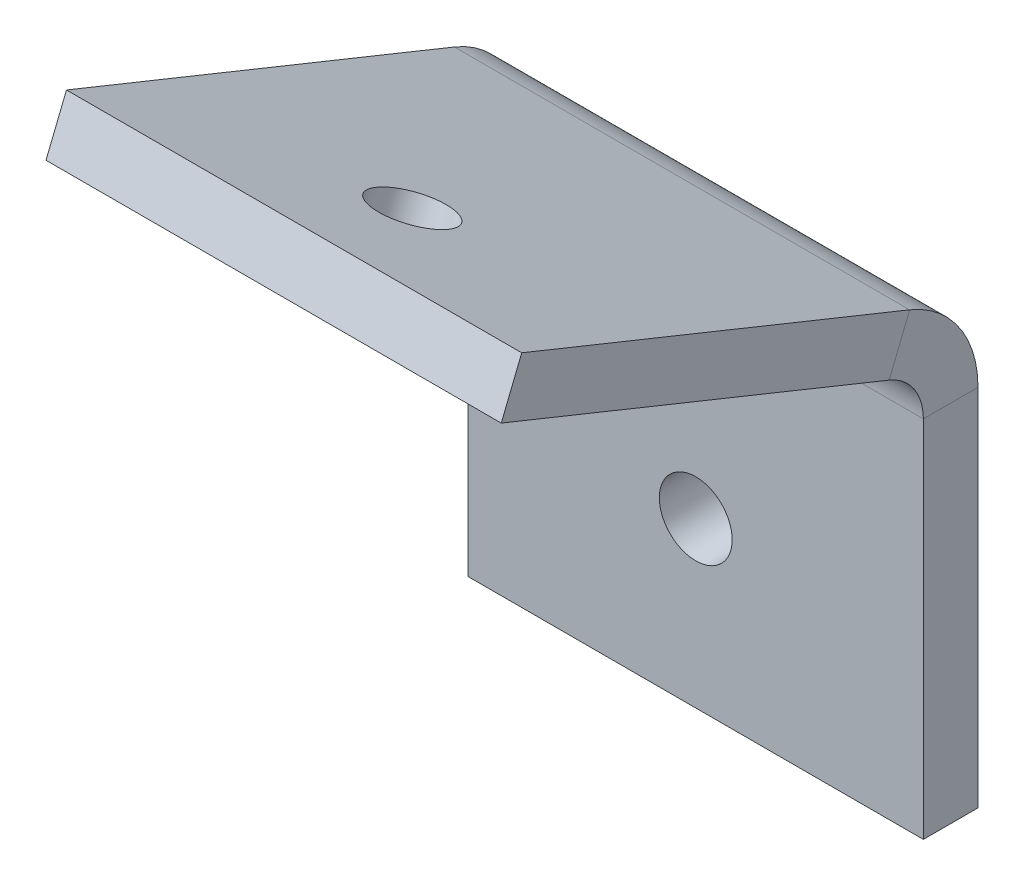
ISO-10303-21;
HEADER;
FILE_DESCRIPTION(('STEP AP214'),'2;1');
FILE_NAME('part.step','',(''),(''),'','','');
FILE_SCHEMA(('AUTOMOTIVE_DESIGN { 1 0 10303 214 1 1 1 1 }'));
ENDSEC;
DATA;
#1=APPLICATION_CONTEXT('core data for automotive mechanical design processes');
#2=APPLICATION_PROTOCOL_DEFINITION('international standard','automotive_design',2000,#1);
#3=PRODUCT_CONTEXT('',#1,'mechanical');
#4=PRODUCT('Part','Part','',(#3));
#5=PRODUCT_RELATED_PRODUCT_CATEGORY('part','',(#4));
#6=PRODUCT_DEFINITION_FORMATION('','',#4);
#7=PRODUCT_DEFINITION_CONTEXT('part definition',#1,'design');
#8=PRODUCT_DEFINITION('design','',#6,#7);
#9=PRODUCT_DEFINITION_SHAPE('','',#8);
#10=(LENGTH_UNIT() NAMED_UNIT(*) SI_UNIT(.MILLI.,.METRE.));
#11=(NAMED_UNIT(*) PLANE_ANGLE_UNIT() SI_UNIT($,.RADIAN.));
#12=(NAMED_UNIT(*) SI_UNIT($,.STERADIAN.) SOLID_ANGLE_UNIT());
#13=UNCERTAINTY_MEASURE_WITH_UNIT(LENGTH_MEASURE(1.E-05),#10,'distance_accuracy_value','');
#14=(GEOMETRIC_REPRESENTATION_CONTEXT(3) GLOBAL_UNCERTAINTY_ASSIGNED_CONTEXT((#13)) GLOBAL_UNIT_ASSIGNED_CONTEXT((#10,
#11,#12)) REPRESENTATION_CONTEXT('',''));
#15=CARTESIAN_POINT('',(0.,0.,0.));
#16=DIRECTION('',(0.,0.,1.));
#17=DIRECTION('',(1.,0.,0.));
#18=AXIS2_PLACEMENT_3D('',#15,#16,#17);
#19=CARTESIAN_POINT('',(-4.52830188679247,-4.24528301886793,-3.));
#20=DIRECTION('',(-1.,0.,0.));
#21=DIRECTION('',(0.,0.,1.));
#22=AXIS2_PLACEMENT_3D('',#19,#20,#21);
#23=PLANE('',#22);
#24=DIRECTION('',(0.,-1.,0.));
#25=VECTOR('',#24,1.);
#26=CARTESIAN_POINT('',(-4.52830188679247,-4.24528301886793,0.));
#27=LINE('',#26,#25);
#28=CARTESIAN_POINT('',(-4.52830188679247,15.7547169811321,0.));
#29=VERTEX_POINT('',#28);
#30=CARTESIAN_POINT('',(-4.52830188679247,-4.24528301886793,0.));
#31=VERTEX_POINT('',#30);
#32=EDGE_CURVE('E96',#29,#31,#27,.T.);
#33=ORIENTED_EDGE('',*,*,#32,.F.);
#34=DIRECTION('',(0.,0.,1.));
#35=VECTOR('',#34,1.);
#36=CARTESIAN_POINT('',(-4.52830188679247,15.7547169811321,-3.));
#37=LINE('',#36,#35);
#38=CARTESIAN_POINT('',(-4.52830188679247,15.7547169811321,-3.));
#39=VERTEX_POINT('',#38);
#40=EDGE_CURVE('E13',#39,#29,#37,.T.);
#41=ORIENTED_EDGE('',*,*,#40,.F.);
#42=DIRECTION('',(0.,-1.,0.));
#43=VECTOR('',#42,1.);
#44=CARTESIAN_POINT('',(-4.52830188679247,-4.24528301886793,-3.));
#45=LINE('',#44,#43);
#46=CARTESIAN_POINT('',(-4.52830188679247,-4.24528301886793,-3.));
#47=VERTEX_POINT('',#46);
#48=EDGE_CURVE('E197',#39,#47,#45,.T.);
#49=ORIENTED_EDGE('',*,*,#48,.T.);
#50=DIRECTION('',(0.,0.,1.));
#51=VECTOR('',#50,1.);
#52=CARTESIAN_POINT('',(-4.52830188679247,-4.24528301886793,-3.));
#53=LINE('',#52,#51);
#54=EDGE_CURVE('E61',#47,#31,#53,.T.);
#55=ORIENTED_EDGE('',*,*,#54,.T.);
#56=EDGE_LOOP('',(#33,#41,#49,#55));
#57=FACE_BOUND('',#56,.T.);
#58=ADVANCED_FACE('F58',(#57),#23,.T.);
#59=CARTESIAN_POINT('',(20.4716981132075,-4.24528301886793,-3.));
#60=DIRECTION('',(1.,0.,0.));
#61=DIRECTION('',(0.,0.,-1.));
#62=AXIS2_PLACEMENT_3D('',#59,#60,#61);
#63=PLANE('',#62);
#64=DIRECTION('',(0.,1.,0.));
#65=VECTOR('',#64,1.);
#66=CARTESIAN_POINT('',(20.4716981132075,-4.24528301886793,0.));
#67=LINE('',#66,#65);
#68=CARTESIAN_POINT('',(20.4716981132075,-4.24528301886793,0.));
#69=VERTEX_POINT('',#68);
#70=CARTESIAN_POINT('',(20.4716981132075,15.7547169811321,0.));
#71=VERTEX_POINT('',#70);
#72=EDGE_CURVE('E211',#69,#71,#67,.T.);
#73=ORIENTED_EDGE('',*,*,#72,.F.);
#74=DIRECTION('',(0.,0.,1.));
#75=VECTOR('',#74,1.);
#76=CARTESIAN_POINT('',(20.4716981132075,-4.24528301886793,-3.));
#77=LINE('',#76,#75);
#78=CARTESIAN_POINT('',(20.4716981132075,-4.24528301886793,-3.));
#79=VERTEX_POINT('',#78);
#80=EDGE_CURVE('E214',#79,#69,#77,.T.);
#81=ORIENTED_EDGE('',*,*,#80,.F.);
#82=DIRECTION('',(0.,1.,0.));
#83=VECTOR('',#82,1.);
#84=CARTESIAN_POINT('',(20.4716981132075,-4.24528301886793,-3.));
#85=LINE('',#84,#83);
#86=CARTESIAN_POINT('',(20.4716981132075,15.7547169811321,-3.));
#87=VERTEX_POINT('',#86);
#88=EDGE_CURVE('E76',#79,#87,#85,.T.);
#89=ORIENTED_EDGE('',*,*,#88,.T.);
#90=DIRECTION('',(0.,0.,1.));
#91=VECTOR('',#90,1.);
#92=CARTESIAN_POINT('',(20.4716981132075,15.7547169811321,-3.));
#93=LINE('',#92,#91);
#94=EDGE_CURVE('E67',#87,#71,#93,.T.);
#95=ORIENTED_EDGE('',*,*,#94,.T.);
#96=EDGE_LOOP('',(#73,#81,#89,#95));
#97=FACE_BOUND('',#96,.T.);
#98=ADVANCED_FACE('F250',(#97),#63,.T.);
#99=CARTESIAN_POINT('',(-4.52830188679247,-4.24528301886793,-3.));
#100=DIRECTION('',(0.,-1.,0.));
#101=DIRECTION('',(0.,0.,-1.));
#102=AXIS2_PLACEMENT_3D('',#99,#100,#101);
#103=PLANE('',#102);
#104=DIRECTION('',(1.,0.,0.));
#105=VECTOR('',#104,1.);
#106=CARTESIAN_POINT('',(-4.52830188679247,-4.24528301886793,0.));
#107=LINE('',#106,#105);
#108=EDGE_CURVE('E208',#31,#69,#107,.T.);
#109=ORIENTED_EDGE('',*,*,#108,.F.);
#110=ORIENTED_EDGE('',*,*,#54,.F.);
#111=DIRECTION('',(1.,0.,0.));
#112=VECTOR('',#111,1.);
#113=CARTESIAN_POINT('',(-4.52830188679247,-4.24528301886793,-3.));
#114=LINE('',#113,#112);
#115=EDGE_CURVE('E200',#47,#79,#114,.T.);
#116=ORIENTED_EDGE('',*,*,#115,.T.);
#117=ORIENTED_EDGE('',*,*,#80,.T.);
#118=EDGE_LOOP('',(#109,#110,#116,#117));
#119=FACE_BOUND('',#118,.T.);
#120=ADVANCED_FACE('F215',(#119),#103,.T.);
#121=CARTESIAN_POINT('',(0.,0.,-3.));
#122=DIRECTION('',(0.,0.,-1.));
#123=DIRECTION('',(-1.,0.,0.));
#124=AXIS2_PLACEMENT_3D('',#121,#122,#123);
#125=PLANE('',#124);
#126=CARTESIAN_POINT('',(7.97169811320753,4.75471698113207,-3.));
#127=DIRECTION('',(0.,0.,1.));
#128=DIRECTION('',(1.,0.,0.));
#129=AXIS2_PLACEMENT_3D('',#126,#127,#128);
#130=CIRCLE('',#129,2.);
#131=CARTESIAN_POINT('',(9.97169811320753,4.75471698113207,-3.));
#132=VERTEX_POINT('',#131);
#133=EDGE_CURVE('E192',#132,#132,#130,.T.);
#134=ORIENTED_EDGE('',*,*,#133,.T.);
#135=EDGE_LOOP('',(#134));
#136=FACE_BOUND('',#135,.T.);
#137=ORIENTED_EDGE('',*,*,#48,.F.);
#138=DIRECTION('',(-1.,0.,0.));
#139=VECTOR('',#138,1.);
#140=CARTESIAN_POINT('',(-4.52830188679247,15.7547169811321,-3.));
#141=LINE('',#140,#139);
#142=EDGE_CURVE('E204',#87,#39,#141,.T.);
#143=ORIENTED_EDGE('',*,*,#142,.F.);
#144=ORIENTED_EDGE('',*,*,#88,.F.);
#145=ORIENTED_EDGE('',*,*,#115,.F.);
#146=EDGE_LOOP('',(#137,#143,#144,#145));
#147=FACE_BOUND('',#146,.T.);
#148=ADVANCED_FACE('F258',(#136,#147),#125,.T.);
#149=CARTESIAN_POINT('',(0.,0.,0.));
#150=DIRECTION('',(0.,0.,-1.));
#151=DIRECTION('',(-1.,0.,0.));
#152=AXIS2_PLACEMENT_3D('',#149,#150,#151);
#153=PLANE('',#152);
#154=CARTESIAN_POINT('',(7.97169811320753,4.75471698113207,0.));
#155=DIRECTION('',(0.,0.,1.));
#156=DIRECTION('',(1.,0.,0.));
#157=AXIS2_PLACEMENT_3D('',#154,#155,#156);
#158=CIRCLE('',#157,2.);
#159=CARTESIAN_POINT('',(9.97169811320753,4.75471698113207,0.));
#160=VERTEX_POINT('',#159);
#161=EDGE_CURVE('E182',#160,#160,#158,.T.);
#162=ORIENTED_EDGE('',*,*,#161,.F.);
#163=EDGE_LOOP('',(#162));
#164=FACE_BOUND('',#163,.T.);
#165=ORIENTED_EDGE('',*,*,#32,.T.);
#166=ORIENTED_EDGE('',*,*,#108,.T.);
#167=ORIENTED_EDGE('',*,*,#72,.T.);
#168=DIRECTION('',(-1.,0.,0.));
#169=VECTOR('',#168,1.);
#170=CARTESIAN_POINT('',(-4.52830188679247,15.7547169811321,0.));
#171=LINE('',#170,#169);
#172=EDGE_CURVE('E201',#71,#29,#171,.T.);
#173=ORIENTED_EDGE('',*,*,#172,.T.);
#174=EDGE_LOOP('',(#165,#166,#167,#173));
#175=FACE_BOUND('',#174,.T.);
#176=ADVANCED_FACE('F217',(#164,#175),#153,.F.);
#177=CARTESIAN_POINT('',(7.97169811320753,4.75471698113207,-3.));
#178=DIRECTION('',(0.,0.,1.));
#179=DIRECTION('',(1.,0.,0.));
#180=AXIS2_PLACEMENT_3D('',#177,#178,#179);
#181=CYLINDRICAL_SURFACE('',#180,2.);
#182=ORIENTED_EDGE('',*,*,#133,.F.);
#183=EDGE_LOOP('',(#182));
#184=FACE_BOUND('',#183,.T.);
#185=ORIENTED_EDGE('',*,*,#161,.T.);
#186=EDGE_LOOP('',(#185));
#187=FACE_BOUND('',#186,.T.);
#188=ADVANCED_FACE('F239',(#184,#187),#181,.F.);
#189=CARTESIAN_POINT('',(20.4716981132075,15.7547169811321,3.));
#190=DIRECTION('',(1.,0.,0.));
#191=DIRECTION('',(0.,0.,-1.));
#192=AXIS2_PLACEMENT_3D('',#189,#190,#191);
#193=PLANE('',#192);
#194=DIRECTION('',(0.,-0.927183854566786,0.374606593415916));
#195=VECTOR('',#194,1.);
#196=CARTESIAN_POINT('',(20.4716981132075,21.3178201085328,0.752360439504503));
#197=LINE('',#196,#195);
#198=CARTESIAN_POINT('',(20.4716981132075,18.5362685448324,1.87618021975225));
#199=VERTEX_POINT('',#198);
#200=CARTESIAN_POINT('',(20.4716981132075,21.3178201085328,0.752360439504503));
#201=VERTEX_POINT('',#200);
#202=EDGE_CURVE('E156',#199,#201,#197,.F.);
#203=ORIENTED_EDGE('',*,*,#202,.F.);
#204=CARTESIAN_POINT('',(20.4716981132075,15.7547169811321,3.));
#205=DIRECTION('',(-1.,0.,0.));
#206=DIRECTION('',(0.,0.,1.));
#207=AXIS2_PLACEMENT_3D('',#204,#205,#206);
#208=CIRCLE('',#207,3.);
#209=EDGE_CURVE('E186',#71,#199,#208,.F.);
#210=ORIENTED_EDGE('',*,*,#209,.F.);
#211=ORIENTED_EDGE('',*,*,#94,.F.);
#212=CARTESIAN_POINT('',(20.4716981132075,15.7547169811321,3.));
#213=DIRECTION('',(-1.,0.,0.));
#214=DIRECTION('',(0.,0.,1.));
#215=AXIS2_PLACEMENT_3D('',#212,#213,#214);
#216=CIRCLE('',#215,6.);
#217=EDGE_CURVE('E179',#87,#201,#216,.F.);
#218=ORIENTED_EDGE('',*,*,#217,.T.);
#219=EDGE_LOOP('',(#203,#210,#211,#218));
#220=FACE_BOUND('',#219,.T.);
#221=ADVANCED_FACE('F237',(#220),#193,.T.);
#222=CARTESIAN_POINT('',(-4.52830188679247,15.7547169811321,3.));
#223=DIRECTION('',(1.,0.,0.));
#224=DIRECTION('',(0.,0.,-1.));
#225=AXIS2_PLACEMENT_3D('',#222,#223,#224);
#226=PLANE('',#225);
#227=CARTESIAN_POINT('',(-4.52830188679247,15.7547169811321,3.));
#228=DIRECTION('',(-1.,0.,0.));
#229=DIRECTION('',(0.,0.,1.));
#230=AXIS2_PLACEMENT_3D('',#227,#228,#229);
#231=CIRCLE('',#230,3.);
#232=CARTESIAN_POINT('',(-4.52830188679247,18.5362685448324,1.87618021975226));
#233=VERTEX_POINT('',#232);
#234=EDGE_CURVE('E189',#233,#29,#231,.T.);
#235=ORIENTED_EDGE('',*,*,#234,.F.);
#236=DIRECTION('',(0.,-0.927183854566786,0.374606593415916));
#237=VECTOR('',#236,1.);
#238=CARTESIAN_POINT('',(-4.52830188679247,18.5362685448324,1.87618021975225));
#239=LINE('',#238,#237);
#240=CARTESIAN_POINT('',(-4.52830188679247,21.3178201085328,0.752360439504506));
#241=VERTEX_POINT('',#240);
#242=EDGE_CURVE('E173',#233,#241,#239,.F.);
#243=ORIENTED_EDGE('',*,*,#242,.T.);
#244=CARTESIAN_POINT('',(-4.52830188679247,15.7547169811321,3.));
#245=DIRECTION('',(-1.,0.,0.));
#246=DIRECTION('',(0.,0.,1.));
#247=AXIS2_PLACEMENT_3D('',#244,#245,#246);
#248=CIRCLE('',#247,6.);
#249=EDGE_CURVE('E183',#241,#39,#248,.T.);
#250=ORIENTED_EDGE('',*,*,#249,.T.);
#251=ORIENTED_EDGE('',*,*,#40,.T.);
#252=EDGE_LOOP('',(#235,#243,#250,#251));
#253=FACE_BOUND('',#252,.T.);
#254=ADVANCED_FACE('F223',(#253),#226,.F.);
#255=CARTESIAN_POINT('',(-4.52830188679247,15.7547169811321,3.));
#256=DIRECTION('',(-1.,0.,0.));
#257=DIRECTION('',(0.,0.927183854566786,-0.374606593415916));
#258=AXIS2_PLACEMENT_3D('',#255,#256,#257);
#259=CYLINDRICAL_SURFACE('',#258,6.);
#260=ORIENTED_EDGE('',*,*,#142,.T.);
#261=ORIENTED_EDGE('',*,*,#249,.F.);
#262=DIRECTION('',(-1.,0.,0.));
#263=VECTOR('',#262,1.);
#264=CARTESIAN_POINT('',(20.4716981132075,21.3178201085328,0.752360439504502));
#265=LINE('',#264,#263);
#266=EDGE_CURVE('E171',#241,#201,#265,.F.);
#267=ORIENTED_EDGE('',*,*,#266,.T.);
#268=ORIENTED_EDGE('',*,*,#217,.F.);
#269=EDGE_LOOP('',(#260,#261,#267,#268));
#270=FACE_BOUND('',#269,.T.);
#271=ADVANCED_FACE('F235',(#270),#259,.T.);
#272=CARTESIAN_POINT('',(-4.52830188679247,15.7547169811321,3.));
#273=DIRECTION('',(-1.,0.,0.));
#274=DIRECTION('',(0.,0.927183854566786,-0.374606593415916));
#275=AXIS2_PLACEMENT_3D('',#272,#273,#274);
#276=CYLINDRICAL_SURFACE('',#275,3.);
#277=ORIENTED_EDGE('',*,*,#172,.F.);
#278=ORIENTED_EDGE('',*,*,#209,.T.);
#279=DIRECTION('',(-1.,0.,0.));
#280=VECTOR('',#279,1.);
#281=CARTESIAN_POINT('',(20.4716981132075,18.5362685448324,1.87618021975225));
#282=LINE('',#281,#280);
#283=EDGE_CURVE('E176',#199,#233,#282,.T.);
#284=ORIENTED_EDGE('',*,*,#283,.T.);
#285=ORIENTED_EDGE('',*,*,#234,.T.);
#286=EDGE_LOOP('',(#277,#278,#284,#285));
#287=FACE_BOUND('',#286,.T.);
#288=ADVANCED_FACE('F225',(#287),#276,.F.);
#289=CARTESIAN_POINT('',(0.,18.3489330885934,-6.59589279282575));
#290=DIRECTION('',(0.,-0.927183854566786,0.374606593415916));
#291=DIRECTION('',(0.,-0.374606593415916,-0.927183854566786));
#292=AXIS2_PLACEMENT_3D('',#289,#290,#291);
#293=PLANE('',#292);
#294=CARTESIAN_POINT('',(7.97169811320753,27.3027127768462,15.5654896019544));
#295=DIRECTION('',(0.,-0.927183854566786,0.374606593415916));
#296=DIRECTION('',(0.,-0.374606593415916,-0.927183854566786));
#297=AXIS2_PLACEMENT_3D('',#294,#295,#296);
#298=CIRCLE('',#297,2.);
#299=CARTESIAN_POINT('',(7.97169811320753,26.5534995900144,13.7111218928208));
#300=VERTEX_POINT('',#299);
#301=EDGE_CURVE('E165',#300,#300,#298,.F.);
#302=ORIENTED_EDGE('',*,*,#301,.F.);
#303=EDGE_LOOP('',(#302));
#304=FACE_BOUND('',#303,.T.);
#305=ORIENTED_EDGE('',*,*,#266,.F.);
#306=DIRECTION('',(0.,0.374606593415916,0.927183854566786));
#307=VECTOR('',#306,1.);
#308=CARTESIAN_POINT('',(-4.52830188679247,18.3489330885934,-6.59589279282575));
#309=LINE('',#308,#307);
#310=CARTESIAN_POINT('',(-4.52830188679246,29.9249589307576,22.0557765839219));
#311=VERTEX_POINT('',#310);
#312=EDGE_CURVE('E139',#241,#311,#309,.T.);
#313=ORIENTED_EDGE('',*,*,#312,.T.);
#314=DIRECTION('',(1.,0.,0.));
#315=VECTOR('',#314,1.);
#316=CARTESIAN_POINT('',(0.,29.9249589307576,22.0557765839219));
#317=LINE('',#316,#315);
#318=CARTESIAN_POINT('',(20.4716981132075,29.9249589307576,22.0557765839219));
#319=VERTEX_POINT('',#318);
#320=EDGE_CURVE('E132',#311,#319,#317,.T.);
#321=ORIENTED_EDGE('',*,*,#320,.T.);
#322=DIRECTION('',(0.,-0.374606593415916,-0.927183854566786));
#323=VECTOR('',#322,1.);
#324=CARTESIAN_POINT('',(20.4716981132075,18.3489330885934,-6.59589279282575));
#325=LINE('',#324,#323);
#326=EDGE_CURVE('E137',#319,#201,#325,.T.);
#327=ORIENTED_EDGE('',*,*,#326,.T.);
#328=EDGE_LOOP('',(#305,#313,#321,#327));
#329=FACE_BOUND('',#328,.T.);
#330=ADVANCED_FACE('F135',(#304,#329),#293,.F.);
#331=CARTESIAN_POINT('',(0.,15.567381524893,-5.472073012578));
#332=DIRECTION('',(0.,-0.927183854566786,0.374606593415916));
#333=DIRECTION('',(0.,-0.374606593415916,-0.927183854566786));
#334=AXIS2_PLACEMENT_3D('',#331,#332,#333);
#335=PLANE('',#334);
#336=CARTESIAN_POINT('',(7.97169811320753,24.5211612131458,16.6893093822021));
#337=DIRECTION('',(0.,-0.927183854566786,0.374606593415916));
#338=DIRECTION('',(0.,-0.374606593415916,-0.927183854566786));
#339=AXIS2_PLACEMENT_3D('',#336,#337,#338);
#340=CIRCLE('',#339,2.);
#341=CARTESIAN_POINT('',(7.97169811320753,23.771948026314,14.8349416730686));
#342=VERTEX_POINT('',#341);
#343=EDGE_CURVE('E168',#342,#342,#340,.F.);
#344=ORIENTED_EDGE('',*,*,#343,.T.);
#345=EDGE_LOOP('',(#344));
#346=FACE_BOUND('',#345,.T.);
#347=DIRECTION('',(0.,-0.374606593415916,-0.927183854566786));
#348=VECTOR('',#347,1.);
#349=CARTESIAN_POINT('',(-4.52830188679246,27.1434073670572,23.1795963641696));
#350=LINE('',#349,#348);
#351=CARTESIAN_POINT('',(-4.52830188679246,27.1434073670572,23.1795963641696));
#352=VERTEX_POINT('',#351);
#353=EDGE_CURVE('E159',#233,#352,#350,.F.);
#354=ORIENTED_EDGE('',*,*,#353,.F.);
#355=ORIENTED_EDGE('',*,*,#283,.F.);
#356=DIRECTION('',(0.,0.374606593415916,0.927183854566786));
#357=VECTOR('',#356,1.);
#358=CARTESIAN_POINT('',(20.4716981132075,17.7782425316593,0.));
#359=LINE('',#358,#357);
#360=CARTESIAN_POINT('',(20.4716981132075,27.1434073670572,23.1795963641696));
#361=VERTEX_POINT('',#360);
#362=EDGE_CURVE('E163',#361,#199,#359,.F.);
#363=ORIENTED_EDGE('',*,*,#362,.F.);
#364=DIRECTION('',(-1.,0.,0.));
#365=VECTOR('',#364,1.);
#366=CARTESIAN_POINT('',(20.4716981132075,27.1434073670572,23.1795963641696));
#367=LINE('',#366,#365);
#368=EDGE_CURVE('E148',#352,#361,#367,.F.);
#369=ORIENTED_EDGE('',*,*,#368,.F.);
#370=EDGE_LOOP('',(#354,#355,#363,#369));
#371=FACE_BOUND('',#370,.T.);
#372=ADVANCED_FACE('F229',(#346,#371),#335,.T.);
#373=CARTESIAN_POINT('',(20.4716981132075,20.5597940953597,-1.12381978024775));
#374=DIRECTION('',(-1.,0.,0.));
#375=DIRECTION('',(0.,0.,1.));
#376=AXIS2_PLACEMENT_3D('',#373,#374,#375);
#377=PLANE('',#376);
#378=ORIENTED_EDGE('',*,*,#202,.T.);
#379=ORIENTED_EDGE('',*,*,#326,.F.);
#380=DIRECTION('',(0.,-0.927183854566786,0.374606593415916));
#381=VECTOR('',#380,1.);
#382=CARTESIAN_POINT('',(20.4716981132075,29.9249589307576,22.0557765839219));
#383=LINE('',#382,#381);
#384=EDGE_CURVE('E143',#319,#361,#383,.T.);
#385=ORIENTED_EDGE('',*,*,#384,.T.);
#386=ORIENTED_EDGE('',*,*,#362,.T.);
#387=EDGE_LOOP('',(#378,#379,#385,#386));
#388=FACE_BOUND('',#387,.T.);
#389=ADVANCED_FACE('F155',(#388),#377,.F.);
#390=CARTESIAN_POINT('',(-4.52830188679246,29.9249589307576,22.0557765839219));
#391=DIRECTION('',(1.,0.,0.));
#392=DIRECTION('',(0.,0.,-1.));
#393=AXIS2_PLACEMENT_3D('',#390,#391,#392);
#394=PLANE('',#393);
#395=ORIENTED_EDGE('',*,*,#242,.F.);
#396=ORIENTED_EDGE('',*,*,#353,.T.);
#397=DIRECTION('',(0.,-0.927183854566786,0.374606593415916));
#398=VECTOR('',#397,1.);
#399=CARTESIAN_POINT('',(-4.52830188679246,29.9249589307576,22.0557765839219));
#400=LINE('',#399,#398);
#401=EDGE_CURVE('E152',#311,#352,#400,.T.);
#402=ORIENTED_EDGE('',*,*,#401,.F.);
#403=ORIENTED_EDGE('',*,*,#312,.F.);
#404=EDGE_LOOP('',(#395,#396,#402,#403));
#405=FACE_BOUND('',#404,.T.);
#406=ADVANCED_FACE('F231',(#405),#394,.F.);
#407=CARTESIAN_POINT('',(20.4716981132075,29.9249589307576,22.0557765839219));
#408=DIRECTION('',(0.,-0.374606593415916,-0.927183854566786));
#409=DIRECTION('',(0.,0.927183854566786,-0.374606593415916));
#410=AXIS2_PLACEMENT_3D('',#407,#408,#409);
#411=PLANE('',#410);
#412=ORIENTED_EDGE('',*,*,#368,.T.);
#413=ORIENTED_EDGE('',*,*,#384,.F.);
#414=ORIENTED_EDGE('',*,*,#320,.F.);
#415=ORIENTED_EDGE('',*,*,#401,.T.);
#416=EDGE_LOOP('',(#412,#413,#414,#415));
#417=FACE_BOUND('',#416,.T.);
#418=ADVANCED_FACE('F146',(#417),#411,.F.);
#419=CARTESIAN_POINT('',(7.97169811320753,27.3027127768462,15.5654896019544));
#420=DIRECTION('',(0.,-0.927183854566786,0.374606593415916));
#421=DIRECTION('',(0.,-0.374606593415916,-0.927183854566786));
#422=AXIS2_PLACEMENT_3D('',#419,#420,#421);
#423=CYLINDRICAL_SURFACE('',#422,2.);
#424=CARTESIAN_POINT('',(7.97169811320753,26.5534995900144,13.7111218928208));
#425=CARTESIAN_POINT('',(7.97169811320753,26.5245250945592,13.7228283488651));
#426=CARTESIAN_POINT('',(7.97169811320753,26.4955505991039,13.7345348049093));
#427=CARTESIAN_POINT('',(7.97169811320753,26.4376016081935,13.7579477169978));
#428=CARTESIAN_POINT('',(7.97169811320753,26.4086271127383,13.7696541730421));
#429=CARTESIAN_POINT('',(7.97169811320753,26.3506781218279,13.7930670851306));
#430=CARTESIAN_POINT('',(7.97169811320753,26.3217036263727,13.8047735411748));
#431=CARTESIAN_POINT('',(7.97169811320753,26.2637546354622,13.8281864532633));
#432=CARTESIAN_POINT('',(7.97169811320753,26.234780140007,13.8398929093075));
#433=CARTESIAN_POINT('',(7.97169811320753,26.1768311490966,13.863305821396));
#434=CARTESIAN_POINT('',(7.97169811320753,26.1478566536414,13.8750122774403));
#435=CARTESIAN_POINT('',(7.97169811320753,26.089907662731,13.8984251895288));
#436=CARTESIAN_POINT('',(7.97169811320753,26.0609331672758,13.910131645573));
#437=CARTESIAN_POINT('',(7.97169811320753,26.0029841763653,13.9335445576615));
#438=CARTESIAN_POINT('',(7.97169811320753,25.9740096809101,13.9452510137058));
#439=CARTESIAN_POINT('',(7.97169811320753,25.9160606899997,13.9686639257943));
#440=CARTESIAN_POINT('',(7.97169811320753,25.8870861945445,13.9803703818385));
#441=CARTESIAN_POINT('',(7.97169811320753,25.8291372036341,14.003783293927));
#442=CARTESIAN_POINT('',(7.97169811320753,25.8001627081788,14.0154897499713));
#443=CARTESIAN_POINT('',(7.97169811320753,25.7422137172684,14.0389026620598));
#444=CARTESIAN_POINT('',(7.97169811320753,25.7132392218132,14.050609118104));
#445=CARTESIAN_POINT('',(7.97169811320753,25.6552902309028,14.0740220301925));
#446=CARTESIAN_POINT('',(7.97169811320753,25.6263157354476,14.0857284862367));
#447=CARTESIAN_POINT('',(7.97169811320753,25.5683667445372,14.1091413983252));
#448=CARTESIAN_POINT('',(7.97169811320753,25.5393922490819,14.1208478543695));
#449=CARTESIAN_POINT('',(7.97169811320753,25.4814432581715,14.144260766458));
#450=CARTESIAN_POINT('',(7.97169811320753,25.4524687627163,14.1559672225022));
#451=CARTESIAN_POINT('',(7.97169811320753,25.3945197718059,14.1793801345907));
#452=CARTESIAN_POINT('',(7.97169811320753,25.3655452763507,14.191086590635));
#453=CARTESIAN_POINT('',(7.97169811320753,25.3075962854402,14.2144995027235));
#454=CARTESIAN_POINT('',(7.97169811320753,25.278621789985,14.2262059587677));
#455=CARTESIAN_POINT('',(7.97169811320753,25.2206727990746,14.2496188708562));
#456=CARTESIAN_POINT('',(7.97169811320753,25.1916983036194,14.2613253269005));
#457=CARTESIAN_POINT('',(7.97169811320753,25.133749312709,14.2847382389889));
#458=CARTESIAN_POINT('',(7.97169811320753,25.1047748172538,14.2964446950332));
#459=CARTESIAN_POINT('',(7.97169811320753,25.0468258263433,14.3198576071217));
#460=CARTESIAN_POINT('',(7.97169811320753,25.0178513308881,14.3315640631659));
#461=CARTESIAN_POINT('',(7.97169811320753,24.9599023399777,14.3549769752544));
#462=CARTESIAN_POINT('',(7.97169811320753,24.9309278445225,14.3666834312987));
#463=CARTESIAN_POINT('',(7.97169811320753,24.8729788536121,14.3900963433872));
#464=CARTESIAN_POINT('',(7.97169811320753,24.8440043581569,14.4018027994314));
#465=CARTESIAN_POINT('',(7.97169811320753,24.7860553672464,14.4252157115199));
#466=CARTESIAN_POINT('',(7.97169811320753,24.7570808717912,14.4369221675642));
#467=CARTESIAN_POINT('',(7.97169811320753,24.6991318808808,14.4603350796527));
#468=CARTESIAN_POINT('',(7.97169811320753,24.6701573854256,14.4720415356969));
#469=CARTESIAN_POINT('',(7.97169811320753,24.6122083945152,14.4954544477854));
#470=CARTESIAN_POINT('',(7.97169811320753,24.5832338990599,14.5071609038296));
#471=CARTESIAN_POINT('',(7.97169811320753,24.5252849081495,14.5305738159181));
#472=CARTESIAN_POINT('',(7.97169811320753,24.4963104126943,14.5422802719624));
#473=CARTESIAN_POINT('',(7.97169811320753,24.4383614217839,14.5656931840509));
#474=CARTESIAN_POINT('',(7.97169811320753,24.4093869263287,14.5773996400951));
#475=CARTESIAN_POINT('',(7.97169811320753,24.3514379354182,14.6008125521836));
#476=CARTESIAN_POINT('',(7.97169811320753,24.322463439963,14.6125190082279));
#477=CARTESIAN_POINT('',(7.97169811320753,24.2645144490526,14.6359319203164));
#478=CARTESIAN_POINT('',(7.97169811320753,24.2355399535974,14.6476383763606));
#479=CARTESIAN_POINT('',(7.97169811320753,24.177590962687,14.6710512884491));
#480=CARTESIAN_POINT('',(7.97169811320753,24.1486164672318,14.6827577444934));
#481=CARTESIAN_POINT('',(7.97169811320753,24.0906674763213,14.7061706565819));
#482=CARTESIAN_POINT('',(7.97169811320753,24.0616929808661,14.7178771126261));
#483=CARTESIAN_POINT('',(7.97169811320753,24.0037439899557,14.7412900247146));
#484=CARTESIAN_POINT('',(7.97169811320753,23.9747694945005,14.7529964807588));
#485=CARTESIAN_POINT('',(7.97169811320753,23.9168205035901,14.7764093928473));
#486=CARTESIAN_POINT('',(7.97169811320753,23.8878460081349,14.7881158488916));
#487=CARTESIAN_POINT('',(7.97169811320753,23.8298970172244,14.8115287609801));
#488=CARTESIAN_POINT('',(7.97169811320753,23.8009225217692,14.8232352170243));
#489=CARTESIAN_POINT('',(7.97169811320753,23.771948026314,14.8349416730686));
#490=B_SPLINE_CURVE_WITH_KNOTS('',3,(#424,#425,#426,#427,#428,#429,#430,#431,#432,#433,#434,
#435,#436,#437,#438,#439,#440,#441,#442,#443,#444,#445,#446,#447,#448,#449,#450,#451,#452,#453,
#454,#455,#456,#457,#458,#459,#460,#461,#462,#463,#464,#465,#466,#467,#468,#469,#470,#471,#472,
#473,#474,#475,#476,#477,#478,#479,#480,#481,#482,#483,#484,#485,#486,#487,#488,#489),
.UNSPECIFIED.,.F.,.F.,(4,2,2,2,2,2,2,2,2,2,2,2,2,2,2,2,2,2,2,2,2,2,2,2,2,2,2,2,2,2,2,2,4),(0.,
0.0937500000000013,0.187500000000003,0.281250000000001,0.375000000000003,0.468750000000002,
0.562500000000003,0.656250000000002,0.750000000000003,0.843750000000002,0.937500000000003,
1.03125,1.125,1.21875,1.3125,1.40625,1.5,1.59375,1.6875,1.78125000000001,1.875,1.96875000000001,
2.0625,2.15625000000001,2.25,2.34375000000001,2.4375,2.53125000000001,2.625,2.71875000000001,
2.8125,2.90625000000001,3.00000000000001),.UNSPECIFIED.);
#491=EDGE_CURVE('BSEAM377',#300,#342,#490,.T.);
#492=ORIENTED_EDGE('',*,*,#301,.T.);
#493=ORIENTED_EDGE('',*,*,#343,.F.);
#494=ORIENTED_EDGE('',*,*,#491,.T.);
#495=ORIENTED_EDGE('',*,*,#491,.F.);
#496=EDGE_LOOP('',(#492,#494,#493,#495));
#497=FACE_BOUND('',#496,.T.);
#498=ADVANCED_FACE('F377',(#497),#423,.F.);
#499=CLOSED_SHELL('',(#58,#98,#120,#148,#176,#188,#221,#254,#271,#288,#330,#372,#389,#406,#418,#498));
#500=MANIFOLD_SOLID_BREP('B2',#499);
#501=ADVANCED_BREP_SHAPE_REPRESENTATION('',(#18,#500),#14);
#502=SHAPE_DEFINITION_REPRESENTATION(#9,#501);
ENDSEC;
END-ISO-10303-21;
